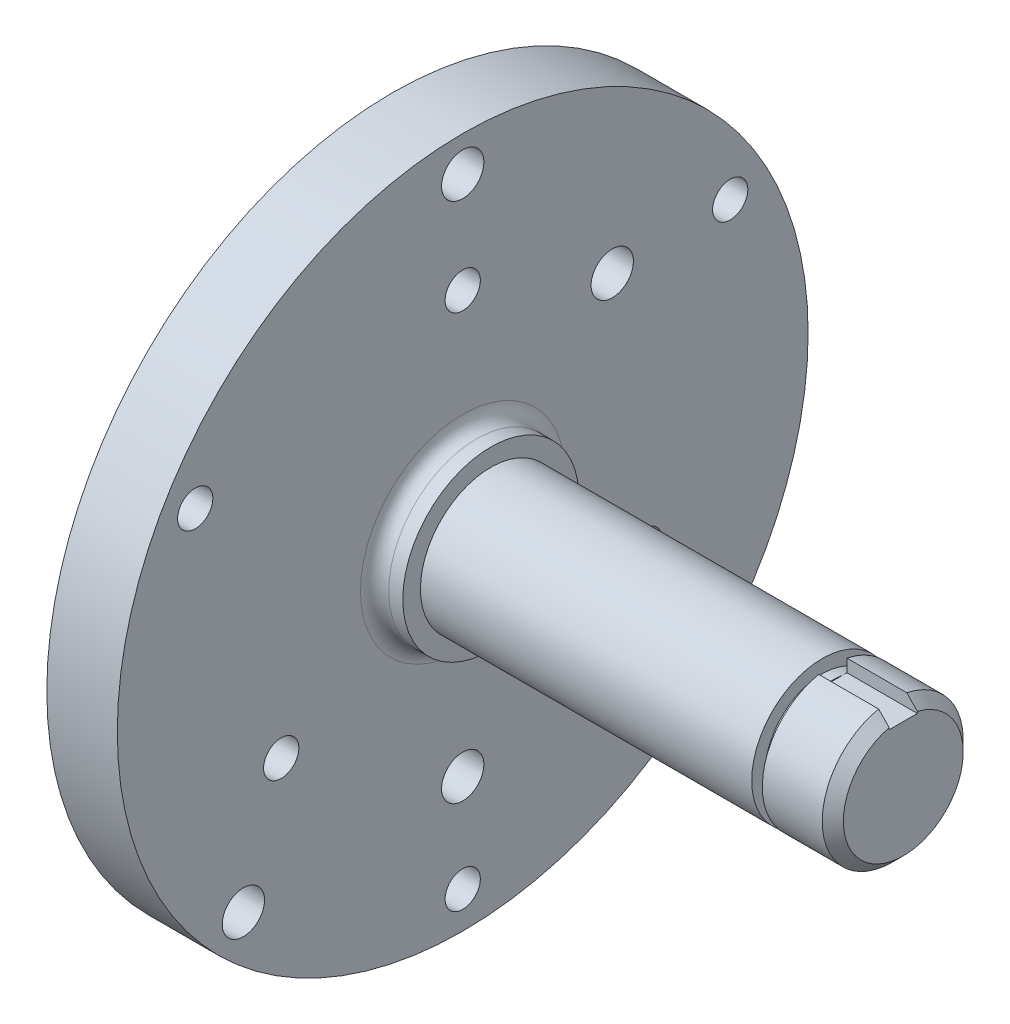
ISO-10303-21;
HEADER;
FILE_DESCRIPTION(('STEP AP214'),'2;1');
FILE_NAME('part.step','',(''),(''),'','','');
FILE_SCHEMA(('AUTOMOTIVE_DESIGN { 1 0 10303 214 1 1 1 1 }'));
ENDSEC;
DATA;
#1=APPLICATION_CONTEXT('core data for automotive mechanical design processes');
#2=APPLICATION_PROTOCOL_DEFINITION('international standard','automotive_design',2000,#1);
#3=PRODUCT_CONTEXT('',#1,'mechanical');
#4=PRODUCT('Part','Part','',(#3));
#5=PRODUCT_RELATED_PRODUCT_CATEGORY('part','',(#4));
#6=PRODUCT_DEFINITION_FORMATION('','',#4);
#7=PRODUCT_DEFINITION_CONTEXT('part definition',#1,'design');
#8=PRODUCT_DEFINITION('design','',#6,#7);
#9=PRODUCT_DEFINITION_SHAPE('','',#8);
#10=(LENGTH_UNIT() NAMED_UNIT(*) SI_UNIT(.MILLI.,.METRE.));
#11=(NAMED_UNIT(*) PLANE_ANGLE_UNIT() SI_UNIT($,.RADIAN.));
#12=(NAMED_UNIT(*) SI_UNIT($,.STERADIAN.) SOLID_ANGLE_UNIT());
#13=UNCERTAINTY_MEASURE_WITH_UNIT(LENGTH_MEASURE(1.E-05),#10,'distance_accuracy_value','');
#14=(GEOMETRIC_REPRESENTATION_CONTEXT(3) GLOBAL_UNCERTAINTY_ASSIGNED_CONTEXT((#13)) GLOBAL_UNIT_ASSIGNED_CONTEXT((#10,
#11,#12)) REPRESENTATION_CONTEXT('',''));
#15=CARTESIAN_POINT('',(0.,0.,0.));
#16=DIRECTION('',(0.,0.,1.));
#17=DIRECTION('',(1.,0.,0.));
#18=AXIS2_PLACEMENT_3D('',#15,#16,#17);
#19=CARTESIAN_POINT('',(58.5,8.50000000000002,0.));
#20=DIRECTION('',(-1.,0.,0.));
#21=DIRECTION('',(0.,0.,1.));
#22=AXIS2_PLACEMENT_3D('',#19,#20,#21);
#23=PLANE('',#22);
#24=CARTESIAN_POINT('',(58.5,0.,0.));
#25=DIRECTION('',(-1.,0.,0.));
#26=DIRECTION('',(0.,0.,1.));
#27=AXIS2_PLACEMENT_3D('',#24,#25,#26);
#28=CIRCLE('',#27,8.50000000000002);
#29=CARTESIAN_POINT('',(58.5,8.26135582092918,-2.));
#30=VERTEX_POINT('',#29);
#31=CARTESIAN_POINT('',(58.5,8.26135582092918,2.));
#32=VERTEX_POINT('',#31);
#33=EDGE_CURVE('E11',#30,#32,#28,.T.);
#34=ORIENTED_EDGE('',*,*,#33,.F.);
#35=DIRECTION('',(0.,1.,0.));
#36=VECTOR('',#35,1.);
#37=CARTESIAN_POINT('',(58.5,12.231945228133,-2.));
#38=LINE('',#37,#36);
#39=CARTESIAN_POINT('',(58.5,8.,-2.));
#40=VERTEX_POINT('',#39);
#41=EDGE_CURVE('E101',#40,#30,#38,.T.);
#42=ORIENTED_EDGE('',*,*,#41,.F.);
#43=DIRECTION('',(0.,0.,-1.));
#44=VECTOR('',#43,1.);
#45=CARTESIAN_POINT('',(58.5,8.,2.));
#46=LINE('',#45,#44);
#47=CARTESIAN_POINT('',(58.5,8.,2.));
#48=VERTEX_POINT('',#47);
#49=EDGE_CURVE('E100',#48,#40,#46,.T.);
#50=ORIENTED_EDGE('',*,*,#49,.F.);
#51=DIRECTION('',(0.,-1.,0.));
#52=VECTOR('',#51,1.);
#53=CARTESIAN_POINT('',(58.5,12.231945228133,2.));
#54=LINE('',#53,#52);
#55=EDGE_CURVE('E90',#32,#48,#54,.T.);
#56=ORIENTED_EDGE('',*,*,#55,.F.);
#57=EDGE_LOOP('',(#34,#42,#50,#56));
#58=FACE_BOUND('',#57,.T.);
#59=ADVANCED_FACE('F36',(#58),#23,.F.);
#60=CARTESIAN_POINT('',(58.5,0.,0.));
#61=DIRECTION('',(-1.,0.,0.));
#62=DIRECTION('',(0.,0.,1.));
#63=AXIS2_PLACEMENT_3D('',#60,#61,#62);
#64=CONICAL_SURFACE('',#63,8.50000000000002,0.785398163397446);
#65=CARTESIAN_POINT('',(57.,0.,0.));
#66=DIRECTION('',(-1.,0.,0.));
#67=DIRECTION('',(0.,0.,1.));
#68=AXIS2_PLACEMENT_3D('',#65,#66,#67);
#69=CIRCLE('',#68,10.);
#70=CARTESIAN_POINT('',(57.,9.79795897113272,-2.));
#71=VERTEX_POINT('',#70);
#72=CARTESIAN_POINT('',(57.,9.79795897113272,2.));
#73=VERTEX_POINT('',#72);
#74=EDGE_CURVE('E43',#71,#73,#69,.T.);
#75=ORIENTED_EDGE('',*,*,#74,.F.);
#76=CARTESIAN_POINT('',(54.9971938274741,11.8350055350737,-2.));
#77=CARTESIAN_POINT('',(55.2751644268277,11.553085229373,-2.));
#78=CARTESIAN_POINT('',(55.5530034546144,11.2710349802146,-2.));
#79=CARTESIAN_POINT('',(56.1083316345354,10.7065888676868,-2.));
#80=CARTESIAN_POINT('',(56.3858207857697,10.424193003432,-2.));
#81=CARTESIAN_POINT('',(56.9403495907767,9.85898306197648,-2.));
#82=CARTESIAN_POINT('',(57.2173892626557,9.57616900254544,-2.));
#83=CARTESIAN_POINT('',(57.7709001367474,9.00998552067228,-2.));
#84=CARTESIAN_POINT('',(58.0473713395309,8.72661609878831,-2.));
#85=CARTESIAN_POINT('',(58.5995749264486,8.15913155704971,-2.));
#86=CARTESIAN_POINT('',(58.8753072747344,7.87501640229085,-2.));
#87=CARTESIAN_POINT('',(59.425743108583,7.3057944808535,-2.));
#88=CARTESIAN_POINT('',(59.7004466012688,7.0206877210664,-2.));
#89=CARTESIAN_POINT('',(60.2484177709535,6.44907146140714,-2.));
#90=CARTESIAN_POINT('',(60.5216853851814,6.16256190125046,-2.));
#91=CARTESIAN_POINT('',(60.929972582894,5.73126239714841,-2.));
#92=CARTESIAN_POINT('',(61.0658008413644,5.58723835884961,-2.));
#93=CARTESIAN_POINT('',(61.3367727838724,5.29854588107358,-2.));
#94=CARTESIAN_POINT('',(61.4719164627037,5.15387743671125,-2.));
#95=CARTESIAN_POINT('',(61.6066441063625,5.00882099854197,-2.));
#96=B_SPLINE_CURVE_WITH_KNOTS('',3,(#76,#77,#78,#79,#80,#81,#82,#83,#84,#85,#86,#87,#88,#89,#90,
#91,#92,#93,#94,#95),.UNSPECIFIED.,.F.,.F.,(4,2,2,2,2,2,2,2,2,4),(0.,1.1877377056553,
2.37547846038731,3.56317011874796,4.75086058408524,5.93860766787936,7.12634651357384,
8.31413685766753,8.90804578151927,9.50195921534978),.UNSPECIFIED.);
#97=EDGE_CURVE('E58',#71,#30,#96,.T.);
#98=ORIENTED_EDGE('',*,*,#97,.T.);
#99=ORIENTED_EDGE('',*,*,#33,.T.);
#100=CARTESIAN_POINT('',(61.6066441063625,5.00882099854197,2.));
#101=CARTESIAN_POINT('',(61.4719164627037,5.15387743671125,2.));
#102=CARTESIAN_POINT('',(61.3367727838724,5.29854588107358,2.));
#103=CARTESIAN_POINT('',(61.0658008413644,5.58723835884961,2.));
#104=CARTESIAN_POINT('',(60.929972582894,5.7312623971484,2.));
#105=CARTESIAN_POINT('',(60.5216853851814,6.16256190125046,2.));
#106=CARTESIAN_POINT('',(60.2484177709535,6.44907146140714,2.));
#107=CARTESIAN_POINT('',(59.7004466012688,7.0206877210664,2.));
#108=CARTESIAN_POINT('',(59.425743108583,7.30579448085349,2.));
#109=CARTESIAN_POINT('',(58.8753072747344,7.87501640229085,2.));
#110=CARTESIAN_POINT('',(58.5995749264487,8.15913155704972,2.));
#111=CARTESIAN_POINT('',(58.0473713395309,8.72661609878832,2.));
#112=CARTESIAN_POINT('',(57.7709001367474,9.00998552067229,2.));
#113=CARTESIAN_POINT('',(57.2173892626557,9.57616900254544,2.));
#114=CARTESIAN_POINT('',(56.9403495907767,9.85898306197648,2.));
#115=CARTESIAN_POINT('',(56.3858207857697,10.424193003432,2.));
#116=CARTESIAN_POINT('',(56.1083316345354,10.7065888676868,2.));
#117=CARTESIAN_POINT('',(55.5530034546144,11.2710349802146,2.));
#118=CARTESIAN_POINT('',(55.2751644268277,11.553085229373,2.));
#119=CARTESIAN_POINT('',(54.9971938274741,11.8350055350737,2.));
#120=B_SPLINE_CURVE_WITH_KNOTS('',3,(#100,#101,#102,#103,#104,#105,#106,#107,#108,#109,#110,
#111,#112,#113,#114,#115,#116,#117,#118,#119),.UNSPECIFIED.,.F.,.F.,(4,2,2,2,2,2,2,2,2,4),(0.,
0.593913433830508,1.18782235768225,2.37561270177594,3.56335154747042,4.75109863126454,
5.93878909660181,7.12648075496247,8.31422150969448,9.50195921534978),.UNSPECIFIED.);
#121=EDGE_CURVE('E96',#32,#73,#120,.T.);
#122=ORIENTED_EDGE('',*,*,#121,.T.);
#123=EDGE_LOOP('',(#75,#98,#99,#122));
#124=FACE_BOUND('',#123,.T.);
#125=ADVANCED_FACE('F126',(#124),#64,.T.);
#126=CARTESIAN_POINT('',(-18.2864310752294,0.,0.));
#127=DIRECTION('',(-1.,0.,0.));
#128=DIRECTION('',(0.,0.,1.));
#129=AXIS2_PLACEMENT_3D('',#126,#127,#128);
#130=CYLINDRICAL_SURFACE('',#129,10.);
#131=CARTESIAN_POINT('',(48.5,0.,0.));
#132=DIRECTION('',(-1.,0.,0.));
#133=DIRECTION('',(0.,0.,1.));
#134=AXIS2_PLACEMENT_3D('',#131,#132,#133);
#135=CIRCLE('',#134,10.);
#136=CARTESIAN_POINT('',(48.5,9.79795897113272,-2.));
#137=VERTEX_POINT('',#136);
#138=CARTESIAN_POINT('',(48.5,9.79795897113272,2.));
#139=VERTEX_POINT('',#138);
#140=EDGE_CURVE('E233',#137,#139,#135,.T.);
#141=ORIENTED_EDGE('',*,*,#140,.F.);
#142=DIRECTION('',(-1.,0.,0.));
#143=VECTOR('',#142,1.);
#144=CARTESIAN_POINT('',(-18.2864310752294,9.79795897113272,-2.));
#145=LINE('',#144,#143);
#146=EDGE_CURVE('E124',#137,#71,#145,.F.);
#147=ORIENTED_EDGE('',*,*,#146,.T.);
#148=ORIENTED_EDGE('',*,*,#74,.T.);
#149=DIRECTION('',(-1.,0.,0.));
#150=VECTOR('',#149,1.);
#151=CARTESIAN_POINT('',(-18.2864310752294,9.79795897113272,2.));
#152=LINE('',#151,#150);
#153=EDGE_CURVE('E115',#73,#139,#152,.T.);
#154=ORIENTED_EDGE('',*,*,#153,.T.);
#155=EDGE_LOOP('',(#141,#147,#148,#154));
#156=FACE_BOUND('',#155,.T.);
#157=ADVANCED_FACE('F239',(#156),#130,.T.);
#158=CARTESIAN_POINT('',(48.5,8.12772302046932,0.));
#159=DIRECTION('',(1.,0.,0.));
#160=DIRECTION('',(0.,0.,-1.));
#161=AXIS2_PLACEMENT_3D('',#158,#159,#160);
#162=PLANE('',#161);
#163=DIRECTION('',(0.,0.,1.));
#164=VECTOR('',#163,1.);
#165=CARTESIAN_POINT('',(48.5,8.,2.));
#166=LINE('',#165,#164);
#167=CARTESIAN_POINT('',(48.5,8.,-2.));
#168=VERTEX_POINT('',#167);
#169=CARTESIAN_POINT('',(48.5,8.,-1.43522872653351));
#170=VERTEX_POINT('',#169);
#171=EDGE_CURVE('E50',#168,#170,#166,.T.);
#172=ORIENTED_EDGE('',*,*,#171,.F.);
#173=DIRECTION('',(0.,-1.,0.));
#174=VECTOR('',#173,1.);
#175=CARTESIAN_POINT('',(48.5,12.231945228133,-2.));
#176=LINE('',#175,#174);
#177=EDGE_CURVE('E118',#137,#168,#176,.T.);
#178=ORIENTED_EDGE('',*,*,#177,.F.);
#179=ORIENTED_EDGE('',*,*,#140,.T.);
#180=DIRECTION('',(0.,1.,0.));
#181=VECTOR('',#180,1.);
#182=CARTESIAN_POINT('',(48.5,12.231945228133,2.));
#183=LINE('',#182,#181);
#184=CARTESIAN_POINT('',(48.5,8.,2.));
#185=VERTEX_POINT('',#184);
#186=EDGE_CURVE('E113',#185,#139,#183,.T.);
#187=ORIENTED_EDGE('',*,*,#186,.F.);
#188=CARTESIAN_POINT('',(48.5,8.,1.43522872653351));
#189=VERTEX_POINT('',#188);
#190=EDGE_CURVE('E107',#189,#185,#166,.T.);
#191=ORIENTED_EDGE('',*,*,#190,.F.);
#192=CARTESIAN_POINT('',(48.5,0.,0.));
#193=DIRECTION('',(-1.,0.,0.));
#194=DIRECTION('',(0.,0.,1.));
#195=AXIS2_PLACEMENT_3D('',#192,#193,#194);
#196=CIRCLE('',#195,8.12772302046932);
#197=EDGE_CURVE('E229',#170,#189,#196,.T.);
#198=ORIENTED_EDGE('',*,*,#197,.F.);
#199=EDGE_LOOP('',(#172,#178,#179,#187,#191,#198));
#200=FACE_BOUND('',#199,.T.);
#201=ADVANCED_FACE('F246',(#200),#162,.F.);
#202=CARTESIAN_POINT('',(-18.2864310752294,0.,0.));
#203=DIRECTION('',(-1.,0.,0.));
#204=DIRECTION('',(0.,0.,1.));
#205=AXIS2_PLACEMENT_3D('',#202,#203,#204);
#206=CYLINDRICAL_SURFACE('',#205,8.12772302046932);
#207=CARTESIAN_POINT('',(47.,0.,0.));
#208=DIRECTION('',(-1.,0.,0.));
#209=DIRECTION('',(0.,0.,1.));
#210=AXIS2_PLACEMENT_3D('',#207,#208,#209);
#211=CIRCLE('',#210,8.12772302046932);
#212=CARTESIAN_POINT('',(47.,0.,8.12772302046932));
#213=VERTEX_POINT('',#212);
#214=EDGE_CURVE('E226',#213,#213,#211,.T.);
#215=ORIENTED_EDGE('',*,*,#214,.F.);
#216=EDGE_LOOP('',(#215));
#217=FACE_BOUND('',#216,.T.);
#218=EDGE_CURVE('E230',#189,#170,#196,.T.);
#219=ORIENTED_EDGE('',*,*,#218,.T.);
#220=ORIENTED_EDGE('',*,*,#197,.T.);
#221=EDGE_LOOP('',(#219,#220));
#222=FACE_BOUND('',#221,.T.);
#223=ADVANCED_FACE('F273',(#217,#222),#206,.T.);
#224=CARTESIAN_POINT('',(47.,10.,0.));
#225=DIRECTION('',(-1.,0.,0.));
#226=DIRECTION('',(0.,0.,1.));
#227=AXIS2_PLACEMENT_3D('',#224,#225,#226);
#228=PLANE('',#227);
#229=CARTESIAN_POINT('',(47.,0.,0.));
#230=DIRECTION('',(-1.,0.,0.));
#231=DIRECTION('',(0.,0.,1.));
#232=AXIS2_PLACEMENT_3D('',#229,#230,#231);
#233=CIRCLE('',#232,10.);
#234=CARTESIAN_POINT('',(47.,0.,10.));
#235=VERTEX_POINT('',#234);
#236=EDGE_CURVE('E223',#235,#235,#233,.T.);
#237=ORIENTED_EDGE('',*,*,#236,.F.);
#238=EDGE_LOOP('',(#237));
#239=FACE_BOUND('',#238,.T.);
#240=ORIENTED_EDGE('',*,*,#214,.T.);
#241=EDGE_LOOP('',(#240));
#242=FACE_BOUND('',#241,.T.);
#243=ADVANCED_FACE('F283',(#239,#242),#228,.F.);
#244=CARTESIAN_POINT('',(-18.2864310752294,0.,0.));
#245=DIRECTION('',(-1.,0.,0.));
#246=DIRECTION('',(0.,0.,1.));
#247=AXIS2_PLACEMENT_3D('',#244,#245,#246);
#248=CYLINDRICAL_SURFACE('',#247,10.);
#249=CARTESIAN_POINT('',(0.,0.,0.));
#250=DIRECTION('',(-1.,0.,0.));
#251=DIRECTION('',(0.,0.,1.));
#252=AXIS2_PLACEMENT_3D('',#249,#250,#251);
#253=CIRCLE('',#252,10.);
#254=CARTESIAN_POINT('',(0.,0.,10.));
#255=VERTEX_POINT('',#254);
#256=EDGE_CURVE('E220',#255,#255,#253,.T.);
#257=ORIENTED_EDGE('',*,*,#256,.F.);
#258=EDGE_LOOP('',(#257));
#259=FACE_BOUND('',#258,.T.);
#260=ORIENTED_EDGE('',*,*,#236,.T.);
#261=EDGE_LOOP('',(#260));
#262=FACE_BOUND('',#261,.T.);
#263=ADVANCED_FACE('F444',(#259,#262),#248,.T.);
#264=CARTESIAN_POINT('',(0.,12.5,0.));
#265=DIRECTION('',(-1.,0.,0.));
#266=DIRECTION('',(0.,0.,1.));
#267=AXIS2_PLACEMENT_3D('',#264,#265,#266);
#268=PLANE('',#267);
#269=CARTESIAN_POINT('',(0.,0.,0.));
#270=DIRECTION('',(-1.,0.,0.));
#271=DIRECTION('',(0.,0.,1.));
#272=AXIS2_PLACEMENT_3D('',#269,#270,#271);
#273=CIRCLE('',#272,12.5);
#274=CARTESIAN_POINT('',(0.,0.,12.5));
#275=VERTEX_POINT('',#274);
#276=EDGE_CURVE('E217',#275,#275,#273,.T.);
#277=ORIENTED_EDGE('',*,*,#276,.F.);
#278=EDGE_LOOP('',(#277));
#279=FACE_BOUND('',#278,.T.);
#280=ORIENTED_EDGE('',*,*,#256,.T.);
#281=EDGE_LOOP('',(#280));
#282=FACE_BOUND('',#281,.T.);
#283=ADVANCED_FACE('F436',(#279,#282),#268,.F.);
#284=CARTESIAN_POINT('',(-18.2864310752294,0.,0.));
#285=DIRECTION('',(-1.,0.,0.));
#286=DIRECTION('',(0.,0.,1.));
#287=AXIS2_PLACEMENT_3D('',#284,#285,#286);
#288=CYLINDRICAL_SURFACE('',#287,12.5);
#289=CARTESIAN_POINT('',(-1.99999999999998,0.,0.));
#290=DIRECTION('',(-1.,0.,0.));
#291=DIRECTION('',(0.,0.,1.));
#292=AXIS2_PLACEMENT_3D('',#289,#290,#291);
#293=CIRCLE('',#292,12.5);
#294=CARTESIAN_POINT('',(-1.99999999999998,0.,12.5));
#295=VERTEX_POINT('',#294);
#296=EDGE_CURVE('E214',#295,#295,#293,.T.);
#297=ORIENTED_EDGE('',*,*,#296,.F.);
#298=EDGE_LOOP('',(#297));
#299=FACE_BOUND('',#298,.T.);
#300=ORIENTED_EDGE('',*,*,#276,.T.);
#301=EDGE_LOOP('',(#300));
#302=FACE_BOUND('',#301,.T.);
#303=ADVANCED_FACE('F428',(#299,#302),#288,.T.);
#304=CARTESIAN_POINT('',(-1.99999999999999,0.,0.));
#305=DIRECTION('',(-1.,0.,0.));
#306=DIRECTION('',(0.,0.,1.));
#307=AXIS2_PLACEMENT_3D('',#304,#305,#306);
#308=TOROIDAL_SURFACE('',#307,14.5,2.);
#309=CARTESIAN_POINT('',(-3.99999999999999,0.,0.));
#310=DIRECTION('',(-1.,0.,0.));
#311=DIRECTION('',(0.,0.,1.));
#312=AXIS2_PLACEMENT_3D('',#309,#310,#311);
#313=CIRCLE('',#312,14.5);
#314=CARTESIAN_POINT('',(-3.99999999999999,0.,14.5));
#315=VERTEX_POINT('',#314);
#316=EDGE_CURVE('E211',#315,#315,#313,.T.);
#317=ORIENTED_EDGE('',*,*,#316,.F.);
#318=EDGE_LOOP('',(#317));
#319=FACE_BOUND('',#318,.T.);
#320=ORIENTED_EDGE('',*,*,#296,.T.);
#321=EDGE_LOOP('',(#320));
#322=FACE_BOUND('',#321,.T.);
#323=ADVANCED_FACE('F421',(#319,#322),#308,.F.);
#324=CARTESIAN_POINT('',(-4.,49.,0.));
#325=DIRECTION('',(-1.,0.,0.));
#326=DIRECTION('',(0.,0.,1.));
#327=AXIS2_PLACEMENT_3D('',#324,#325,#326);
#328=PLANE('',#327);
#329=CARTESIAN_POINT('',(-4.,-14.8660687473183,-25.7487863791676));
#330=DIRECTION('',(1.,0.,0.));
#331=DIRECTION('',(0.,0.,-1.));
#332=AXIS2_PLACEMENT_3D('',#329,#330,#331);
#333=CIRCLE('',#332,2.49999999999999);
#334=CARTESIAN_POINT('',(-4.,-14.8660687473183,-28.2487863791676));
#335=VERTEX_POINT('',#334);
#336=EDGE_CURVE('E148',#335,#335,#333,.T.);
#337=ORIENTED_EDGE('',*,*,#336,.F.);
#338=EDGE_LOOP('',(#337));
#339=FACE_BOUND('',#338,.T.);
#340=CARTESIAN_POINT('',(-4.,21.9089023002063,37.9473319220208));
#341=DIRECTION('',(1.,0.,0.));
#342=DIRECTION('',(0.,0.,-1.));
#343=AXIS2_PLACEMENT_3D('',#340,#341,#342);
#344=CIRCLE('',#343,2.49999999999999);
#345=CARTESIAN_POINT('',(-4.,21.9089023002063,35.4473319220208));
#346=VERTEX_POINT('',#345);
#347=EDGE_CURVE('E154',#346,#346,#344,.T.);
#348=ORIENTED_EDGE('',*,*,#347,.F.);
#349=EDGE_LOOP('',(#348));
#350=FACE_BOUND('',#349,.T.);
#351=CARTESIAN_POINT('',(-4.,-14.8660687473186,25.7487863791674));
#352=DIRECTION('',(1.,0.,0.));
#353=DIRECTION('',(0.,0.,-1.));
#354=AXIS2_PLACEMENT_3D('',#351,#352,#353);
#355=CIRCLE('',#354,2.49999999999999);
#356=CARTESIAN_POINT('',(-4.,-14.8660687473186,23.2487863791674));
#357=VERTEX_POINT('',#356);
#358=EDGE_CURVE('E160',#357,#357,#355,.T.);
#359=ORIENTED_EDGE('',*,*,#358,.F.);
#360=EDGE_LOOP('',(#359));
#361=FACE_BOUND('',#360,.T.);
#362=CARTESIAN_POINT('',(-4.,21.9089023002068,-37.9473319220205));
#363=DIRECTION('',(1.,0.,0.));
#364=DIRECTION('',(0.,0.,-1.));
#365=AXIS2_PLACEMENT_3D('',#362,#363,#364);
#366=CIRCLE('',#365,2.49999999999999);
#367=CARTESIAN_POINT('',(-4.,21.9089023002068,-40.4473319220204));
#368=VERTEX_POINT('',#367);
#369=EDGE_CURVE('E166',#368,#368,#366,.T.);
#370=ORIENTED_EDGE('',*,*,#369,.F.);
#371=EDGE_LOOP('',(#370));
#372=FACE_BOUND('',#371,.T.);
#373=CARTESIAN_POINT('',(-4.,29.732137494637,0.));
#374=DIRECTION('',(1.,0.,0.));
#375=DIRECTION('',(0.,0.,-1.));
#376=AXIS2_PLACEMENT_3D('',#373,#374,#375);
#377=CIRCLE('',#376,2.49999999999999);
#378=CARTESIAN_POINT('',(-4.,29.732137494637,-2.49999999999999));
#379=VERTEX_POINT('',#378);
#380=EDGE_CURVE('E172',#379,#379,#377,.T.);
#381=ORIENTED_EDGE('',*,*,#380,.F.);
#382=EDGE_LOOP('',(#381));
#383=FACE_BOUND('',#382,.T.);
#384=CARTESIAN_POINT('',(-4.,-43.8178046004133,0.));
#385=DIRECTION('',(1.,0.,0.));
#386=DIRECTION('',(0.,0.,-1.));
#387=AXIS2_PLACEMENT_3D('',#384,#385,#386);
#388=CIRCLE('',#387,2.49999999999999);
#389=CARTESIAN_POINT('',(-4.,-43.8178046004133,-2.49999999999999));
#390=VERTEX_POINT('',#389);
#391=EDGE_CURVE('E178',#390,#390,#388,.T.);
#392=ORIENTED_EDGE('',*,*,#391,.F.);
#393=EDGE_LOOP('',(#392));
#394=FACE_BOUND('',#393,.T.);
#395=CARTESIAN_POINT('',(-3.99999999999999,-31.1126983722081,31.112698372208));
#396=DIRECTION('',(-1.,0.,0.));
#397=DIRECTION('',(0.,0.,1.));
#398=AXIS2_PLACEMENT_3D('',#395,#396,#397);
#399=CIRCLE('',#398,3.);
#400=CARTESIAN_POINT('',(-3.99999999999999,-31.1126983722081,34.112698372208));
#401=VERTEX_POINT('',#400);
#402=EDGE_CURVE('E184',#401,#401,#399,.F.);
#403=ORIENTED_EDGE('',*,*,#402,.F.);
#404=EDGE_LOOP('',(#403));
#405=FACE_BOUND('',#404,.T.);
#406=CARTESIAN_POINT('',(-3.99999999999999,44.,0.));
#407=DIRECTION('',(-1.,0.,0.));
#408=DIRECTION('',(0.,0.,1.));
#409=AXIS2_PLACEMENT_3D('',#406,#407,#408);
#410=CIRCLE('',#409,3.);
#411=CARTESIAN_POINT('',(-3.99999999999999,44.,3.));
#412=VERTEX_POINT('',#411);
#413=EDGE_CURVE('E190',#412,#412,#410,.F.);
#414=ORIENTED_EDGE('',*,*,#413,.F.);
#415=EDGE_LOOP('',(#414));
#416=FACE_BOUND('',#415,.T.);
#417=CARTESIAN_POINT('',(-3.99999999999999,21.2132034355963,-21.2132034355965));
#418=DIRECTION('',(-1.,0.,0.));
#419=DIRECTION('',(0.,0.,1.));
#420=AXIS2_PLACEMENT_3D('',#417,#418,#419);
#421=CIRCLE('',#420,2.99999999999999);
#422=CARTESIAN_POINT('',(-3.99999999999999,21.2132034355963,-18.2132034355965));
#423=VERTEX_POINT('',#422);
#424=EDGE_CURVE('E196',#423,#423,#421,.F.);
#425=ORIENTED_EDGE('',*,*,#424,.F.);
#426=EDGE_LOOP('',(#425));
#427=FACE_BOUND('',#426,.T.);
#428=CARTESIAN_POINT('',(-3.99999999999999,-30.,0.));
#429=DIRECTION('',(-1.,0.,0.));
#430=DIRECTION('',(0.,0.,1.));
#431=AXIS2_PLACEMENT_3D('',#428,#429,#430);
#432=CIRCLE('',#431,3.);
#433=CARTESIAN_POINT('',(-3.99999999999999,-30.,3.00000000000001));
#434=VERTEX_POINT('',#433);
#435=EDGE_CURVE('E202',#434,#434,#432,.F.);
#436=ORIENTED_EDGE('',*,*,#435,.F.);
#437=EDGE_LOOP('',(#436));
#438=FACE_BOUND('',#437,.T.);
#439=CARTESIAN_POINT('',(-4.,0.,0.));
#440=DIRECTION('',(-1.,0.,0.));
#441=DIRECTION('',(0.,0.,1.));
#442=AXIS2_PLACEMENT_3D('',#439,#440,#441);
#443=CIRCLE('',#442,49.);
#444=CARTESIAN_POINT('',(-4.,0.,49.));
#445=VERTEX_POINT('',#444);
#446=EDGE_CURVE('E208',#445,#445,#443,.T.);
#447=ORIENTED_EDGE('',*,*,#446,.F.);
#448=EDGE_LOOP('',(#447));
#449=FACE_BOUND('',#448,.T.);
#450=ORIENTED_EDGE('',*,*,#316,.T.);
#451=EDGE_LOOP('',(#450));
#452=FACE_BOUND('',#451,.T.);
#453=ADVANCED_FACE('F413',(#339,#350,#361,#372,#383,#394,#405,#416,#427,#438,#449,#452),#328,.F.);
#454=CARTESIAN_POINT('',(-18.2864310752294,0.,0.));
#455=DIRECTION('',(-1.,0.,0.));
#456=DIRECTION('',(0.,0.,1.));
#457=AXIS2_PLACEMENT_3D('',#454,#455,#456);
#458=CYLINDRICAL_SURFACE('',#457,49.);
#459=CARTESIAN_POINT('',(-14.,0.,0.));
#460=DIRECTION('',(-1.,0.,0.));
#461=DIRECTION('',(0.,0.,1.));
#462=AXIS2_PLACEMENT_3D('',#459,#460,#461);
#463=CIRCLE('',#462,49.);
#464=CARTESIAN_POINT('',(-14.,0.,49.));
#465=VERTEX_POINT('',#464);
#466=EDGE_CURVE('E205',#465,#465,#463,.T.);
#467=ORIENTED_EDGE('',*,*,#466,.F.);
#468=EDGE_LOOP('',(#467));
#469=FACE_BOUND('',#468,.T.);
#470=ORIENTED_EDGE('',*,*,#446,.T.);
#471=EDGE_LOOP('',(#470));
#472=FACE_BOUND('',#471,.T.);
#473=ADVANCED_FACE('F405',(#469,#472),#458,.T.);
#474=CARTESIAN_POINT('',(-14.,0.,0.));
#475=DIRECTION('',(1.,0.,0.));
#476=DIRECTION('',(0.,0.,-1.));
#477=AXIS2_PLACEMENT_3D('',#474,#475,#476);
#478=PLANE('',#477);
#479=CARTESIAN_POINT('',(-14.,-14.8660687473183,-25.7487863791676));
#480=DIRECTION('',(1.,0.,0.));
#481=DIRECTION('',(0.,0.,-1.));
#482=AXIS2_PLACEMENT_3D('',#479,#480,#481);
#483=CIRCLE('',#482,2.49999999999999);
#484=CARTESIAN_POINT('',(-14.,-14.8660687473183,-28.2487863791676));
#485=VERTEX_POINT('',#484);
#486=EDGE_CURVE('E145',#485,#485,#483,.T.);
#487=ORIENTED_EDGE('',*,*,#486,.T.);
#488=EDGE_LOOP('',(#487));
#489=FACE_BOUND('',#488,.T.);
#490=CARTESIAN_POINT('',(-14.,21.9089023002063,37.9473319220208));
#491=DIRECTION('',(1.,0.,0.));
#492=DIRECTION('',(0.,0.,-1.));
#493=AXIS2_PLACEMENT_3D('',#490,#491,#492);
#494=CIRCLE('',#493,2.49999999999999);
#495=CARTESIAN_POINT('',(-14.,21.9089023002063,35.4473319220208));
#496=VERTEX_POINT('',#495);
#497=EDGE_CURVE('E151',#496,#496,#494,.T.);
#498=ORIENTED_EDGE('',*,*,#497,.T.);
#499=EDGE_LOOP('',(#498));
#500=FACE_BOUND('',#499,.T.);
#501=CARTESIAN_POINT('',(-14.,-14.8660687473186,25.7487863791674));
#502=DIRECTION('',(1.,0.,0.));
#503=DIRECTION('',(0.,0.,-1.));
#504=AXIS2_PLACEMENT_3D('',#501,#502,#503);
#505=CIRCLE('',#504,2.49999999999999);
#506=CARTESIAN_POINT('',(-14.,-14.8660687473186,23.2487863791674));
#507=VERTEX_POINT('',#506);
#508=EDGE_CURVE('E157',#507,#507,#505,.T.);
#509=ORIENTED_EDGE('',*,*,#508,.T.);
#510=EDGE_LOOP('',(#509));
#511=FACE_BOUND('',#510,.T.);
#512=CARTESIAN_POINT('',(-14.,21.9089023002068,-37.9473319220205));
#513=DIRECTION('',(1.,0.,0.));
#514=DIRECTION('',(0.,0.,-1.));
#515=AXIS2_PLACEMENT_3D('',#512,#513,#514);
#516=CIRCLE('',#515,2.49999999999999);
#517=CARTESIAN_POINT('',(-14.,21.9089023002068,-40.4473319220204));
#518=VERTEX_POINT('',#517);
#519=EDGE_CURVE('E163',#518,#518,#516,.T.);
#520=ORIENTED_EDGE('',*,*,#519,.T.);
#521=EDGE_LOOP('',(#520));
#522=FACE_BOUND('',#521,.T.);
#523=CARTESIAN_POINT('',(-14.,29.732137494637,0.));
#524=DIRECTION('',(1.,0.,0.));
#525=DIRECTION('',(0.,0.,-1.));
#526=AXIS2_PLACEMENT_3D('',#523,#524,#525);
#527=CIRCLE('',#526,2.49999999999999);
#528=CARTESIAN_POINT('',(-14.,29.732137494637,-2.49999999999999));
#529=VERTEX_POINT('',#528);
#530=EDGE_CURVE('E169',#529,#529,#527,.T.);
#531=ORIENTED_EDGE('',*,*,#530,.T.);
#532=EDGE_LOOP('',(#531));
#533=FACE_BOUND('',#532,.T.);
#534=CARTESIAN_POINT('',(-14.,-43.8178046004133,0.));
#535=DIRECTION('',(1.,0.,0.));
#536=DIRECTION('',(0.,0.,-1.));
#537=AXIS2_PLACEMENT_3D('',#534,#535,#536);
#538=CIRCLE('',#537,2.49999999999999);
#539=CARTESIAN_POINT('',(-14.,-43.8178046004133,-2.49999999999999));
#540=VERTEX_POINT('',#539);
#541=EDGE_CURVE('E175',#540,#540,#538,.T.);
#542=ORIENTED_EDGE('',*,*,#541,.T.);
#543=EDGE_LOOP('',(#542));
#544=FACE_BOUND('',#543,.T.);
#545=CARTESIAN_POINT('',(-14.,-31.1126983722081,31.112698372208));
#546=DIRECTION('',(-1.,0.,0.));
#547=DIRECTION('',(0.,0.,1.));
#548=AXIS2_PLACEMENT_3D('',#545,#546,#547);
#549=CIRCLE('',#548,3.);
#550=CARTESIAN_POINT('',(-14.,-31.1126983722081,34.112698372208));
#551=VERTEX_POINT('',#550);
#552=EDGE_CURVE('E181',#551,#551,#549,.T.);
#553=ORIENTED_EDGE('',*,*,#552,.F.);
#554=EDGE_LOOP('',(#553));
#555=FACE_BOUND('',#554,.T.);
#556=CARTESIAN_POINT('',(-14.,44.,0.));
#557=DIRECTION('',(-1.,0.,0.));
#558=DIRECTION('',(0.,0.,1.));
#559=AXIS2_PLACEMENT_3D('',#556,#557,#558);
#560=CIRCLE('',#559,3.);
#561=CARTESIAN_POINT('',(-14.,44.,3.));
#562=VERTEX_POINT('',#561);
#563=EDGE_CURVE('E187',#562,#562,#560,.T.);
#564=ORIENTED_EDGE('',*,*,#563,.F.);
#565=EDGE_LOOP('',(#564));
#566=FACE_BOUND('',#565,.T.);
#567=CARTESIAN_POINT('',(-14.,21.2132034355963,-21.2132034355965));
#568=DIRECTION('',(-1.,0.,0.));
#569=DIRECTION('',(0.,0.,1.));
#570=AXIS2_PLACEMENT_3D('',#567,#568,#569);
#571=CIRCLE('',#570,2.99999999999999);
#572=CARTESIAN_POINT('',(-14.,21.2132034355963,-18.2132034355965));
#573=VERTEX_POINT('',#572);
#574=EDGE_CURVE('E193',#573,#573,#571,.T.);
#575=ORIENTED_EDGE('',*,*,#574,.F.);
#576=EDGE_LOOP('',(#575));
#577=FACE_BOUND('',#576,.T.);
#578=CARTESIAN_POINT('',(-14.,-30.,0.));
#579=DIRECTION('',(-1.,0.,0.));
#580=DIRECTION('',(0.,0.,1.));
#581=AXIS2_PLACEMENT_3D('',#578,#579,#580);
#582=CIRCLE('',#581,3.);
#583=CARTESIAN_POINT('',(-14.,-30.,3.00000000000001));
#584=VERTEX_POINT('',#583);
#585=EDGE_CURVE('E199',#584,#584,#582,.T.);
#586=ORIENTED_EDGE('',*,*,#585,.F.);
#587=EDGE_LOOP('',(#586));
#588=FACE_BOUND('',#587,.T.);
#589=ORIENTED_EDGE('',*,*,#466,.T.);
#590=EDGE_LOOP('',(#589));
#591=FACE_BOUND('',#590,.T.);
#592=ADVANCED_FACE('F396',(#489,#500,#511,#522,#533,#544,#555,#566,#577,#588,#591),#478,.F.);
#593=CARTESIAN_POINT('',(58.501,-30.,0.));
#594=DIRECTION('',(-1.,0.,0.));
#595=DIRECTION('',(0.,0.,1.));
#596=AXIS2_PLACEMENT_3D('',#593,#594,#595);
#597=CYLINDRICAL_SURFACE('',#596,3.);
#598=ORIENTED_EDGE('',*,*,#585,.T.);
#599=EDGE_LOOP('',(#598));
#600=FACE_BOUND('',#599,.T.);
#601=ORIENTED_EDGE('',*,*,#435,.T.);
#602=EDGE_LOOP('',(#601));
#603=FACE_BOUND('',#602,.T.);
#604=ADVANCED_FACE('F388',(#600,#603),#597,.F.);
#605=CARTESIAN_POINT('',(58.501,21.2132034355963,-21.2132034355965));
#606=DIRECTION('',(-1.,0.,0.));
#607=DIRECTION('',(0.,0.,1.));
#608=AXIS2_PLACEMENT_3D('',#605,#606,#607);
#609=CYLINDRICAL_SURFACE('',#608,2.99999999999999);
#610=ORIENTED_EDGE('',*,*,#574,.T.);
#611=EDGE_LOOP('',(#610));
#612=FACE_BOUND('',#611,.T.);
#613=ORIENTED_EDGE('',*,*,#424,.T.);
#614=EDGE_LOOP('',(#613));
#615=FACE_BOUND('',#614,.T.);
#616=ADVANCED_FACE('F380',(#612,#615),#609,.F.);
#617=CARTESIAN_POINT('',(58.501,44.,0.));
#618=DIRECTION('',(-1.,0.,0.));
#619=DIRECTION('',(0.,0.,1.));
#620=AXIS2_PLACEMENT_3D('',#617,#618,#619);
#621=CYLINDRICAL_SURFACE('',#620,3.);
#622=ORIENTED_EDGE('',*,*,#563,.T.);
#623=EDGE_LOOP('',(#622));
#624=FACE_BOUND('',#623,.T.);
#625=ORIENTED_EDGE('',*,*,#413,.T.);
#626=EDGE_LOOP('',(#625));
#627=FACE_BOUND('',#626,.T.);
#628=ADVANCED_FACE('F372',(#624,#627),#621,.F.);
#629=CARTESIAN_POINT('',(58.501,-31.1126983722081,31.112698372208));
#630=DIRECTION('',(-1.,0.,0.));
#631=DIRECTION('',(0.,0.,1.));
#632=AXIS2_PLACEMENT_3D('',#629,#630,#631);
#633=CYLINDRICAL_SURFACE('',#632,3.);
#634=ORIENTED_EDGE('',*,*,#552,.T.);
#635=EDGE_LOOP('',(#634));
#636=FACE_BOUND('',#635,.T.);
#637=ORIENTED_EDGE('',*,*,#402,.T.);
#638=EDGE_LOOP('',(#637));
#639=FACE_BOUND('',#638,.T.);
#640=ADVANCED_FACE('F364',(#636,#639),#633,.F.);
#641=CARTESIAN_POINT('',(-4.,-43.8178046004133,0.));
#642=DIRECTION('',(1.,0.,0.));
#643=DIRECTION('',(0.,0.,-1.));
#644=AXIS2_PLACEMENT_3D('',#641,#642,#643);
#645=CYLINDRICAL_SURFACE('',#644,2.49999999999999);
#646=ORIENTED_EDGE('',*,*,#541,.F.);
#647=EDGE_LOOP('',(#646));
#648=FACE_BOUND('',#647,.T.);
#649=ORIENTED_EDGE('',*,*,#391,.T.);
#650=EDGE_LOOP('',(#649));
#651=FACE_BOUND('',#650,.T.);
#652=ADVANCED_FACE('F356',(#648,#651),#645,.F.);
#653=CARTESIAN_POINT('',(-4.,29.732137494637,0.));
#654=DIRECTION('',(1.,0.,0.));
#655=DIRECTION('',(0.,0.,-1.));
#656=AXIS2_PLACEMENT_3D('',#653,#654,#655);
#657=CYLINDRICAL_SURFACE('',#656,2.49999999999999);
#658=ORIENTED_EDGE('',*,*,#530,.F.);
#659=EDGE_LOOP('',(#658));
#660=FACE_BOUND('',#659,.T.);
#661=ORIENTED_EDGE('',*,*,#380,.T.);
#662=EDGE_LOOP('',(#661));
#663=FACE_BOUND('',#662,.T.);
#664=ADVANCED_FACE('F348',(#660,#663),#657,.F.);
#665=CARTESIAN_POINT('',(-4.,21.9089023002068,-37.9473319220205));
#666=DIRECTION('',(1.,0.,0.));
#667=DIRECTION('',(0.,0.,-1.));
#668=AXIS2_PLACEMENT_3D('',#665,#666,#667);
#669=CYLINDRICAL_SURFACE('',#668,2.49999999999999);
#670=ORIENTED_EDGE('',*,*,#519,.F.);
#671=EDGE_LOOP('',(#670));
#672=FACE_BOUND('',#671,.T.);
#673=ORIENTED_EDGE('',*,*,#369,.T.);
#674=EDGE_LOOP('',(#673));
#675=FACE_BOUND('',#674,.T.);
#676=ADVANCED_FACE('F340',(#672,#675),#669,.F.);
#677=CARTESIAN_POINT('',(-4.,-14.8660687473186,25.7487863791674));
#678=DIRECTION('',(1.,0.,0.));
#679=DIRECTION('',(0.,0.,-1.));
#680=AXIS2_PLACEMENT_3D('',#677,#678,#679);
#681=CYLINDRICAL_SURFACE('',#680,2.49999999999999);
#682=ORIENTED_EDGE('',*,*,#508,.F.);
#683=EDGE_LOOP('',(#682));
#684=FACE_BOUND('',#683,.T.);
#685=ORIENTED_EDGE('',*,*,#358,.T.);
#686=EDGE_LOOP('',(#685));
#687=FACE_BOUND('',#686,.T.);
#688=ADVANCED_FACE('F334',(#684,#687),#681,.F.);
#689=CARTESIAN_POINT('',(-4.,21.9089023002063,37.9473319220208));
#690=DIRECTION('',(1.,0.,0.));
#691=DIRECTION('',(0.,0.,-1.));
#692=AXIS2_PLACEMENT_3D('',#689,#690,#691);
#693=CYLINDRICAL_SURFACE('',#692,2.49999999999999);
#694=ORIENTED_EDGE('',*,*,#497,.F.);
#695=EDGE_LOOP('',(#694));
#696=FACE_BOUND('',#695,.T.);
#697=ORIENTED_EDGE('',*,*,#347,.T.);
#698=EDGE_LOOP('',(#697));
#699=FACE_BOUND('',#698,.T.);
#700=ADVANCED_FACE('F328',(#696,#699),#693,.F.);
#701=CARTESIAN_POINT('',(-4.,-14.8660687473183,-25.7487863791676));
#702=DIRECTION('',(1.,0.,0.));
#703=DIRECTION('',(0.,0.,-1.));
#704=AXIS2_PLACEMENT_3D('',#701,#702,#703);
#705=CYLINDRICAL_SURFACE('',#704,2.49999999999999);
#706=ORIENTED_EDGE('',*,*,#486,.F.);
#707=EDGE_LOOP('',(#706));
#708=FACE_BOUND('',#707,.T.);
#709=ORIENTED_EDGE('',*,*,#336,.T.);
#710=EDGE_LOOP('',(#709));
#711=FACE_BOUND('',#710,.T.);
#712=ADVANCED_FACE('F139',(#708,#711),#705,.F.);
#713=CARTESIAN_POINT('',(42.676825572429,12.231945228133,-2.));
#714=DIRECTION('',(0.,0.,-1.));
#715=DIRECTION('',(0.,1.,0.));
#716=AXIS2_PLACEMENT_3D('',#713,#714,#715);
#717=PLANE('',#716);
#718=ORIENTED_EDGE('',*,*,#146,.F.);
#719=ORIENTED_EDGE('',*,*,#177,.T.);
#720=DIRECTION('',(1.,0.,0.));
#721=VECTOR('',#720,1.);
#722=CARTESIAN_POINT('',(42.676825572429,8.,-2.));
#723=LINE('',#722,#721);
#724=EDGE_CURVE('E108',#168,#40,#723,.T.);
#725=ORIENTED_EDGE('',*,*,#724,.T.);
#726=ORIENTED_EDGE('',*,*,#41,.T.);
#727=ORIENTED_EDGE('',*,*,#97,.F.);
#728=EDGE_LOOP('',(#718,#719,#725,#726,#727));
#729=FACE_BOUND('',#728,.T.);
#730=ADVANCED_FACE('F134',(#729),#717,.F.);
#731=CARTESIAN_POINT('',(42.676825572429,12.231945228133,2.));
#732=DIRECTION('',(0.,0.,1.));
#733=DIRECTION('',(0.,-1.,0.));
#734=AXIS2_PLACEMENT_3D('',#731,#732,#733);
#735=PLANE('',#734);
#736=ORIENTED_EDGE('',*,*,#55,.T.);
#737=DIRECTION('',(1.,0.,0.));
#738=VECTOR('',#737,1.);
#739=CARTESIAN_POINT('',(42.676825572429,8.,2.));
#740=LINE('',#739,#738);
#741=EDGE_CURVE('E93',#185,#48,#740,.T.);
#742=ORIENTED_EDGE('',*,*,#741,.F.);
#743=ORIENTED_EDGE('',*,*,#186,.T.);
#744=ORIENTED_EDGE('',*,*,#153,.F.);
#745=ORIENTED_EDGE('',*,*,#121,.F.);
#746=EDGE_LOOP('',(#736,#742,#743,#744,#745));
#747=FACE_BOUND('',#746,.T.);
#748=ADVANCED_FACE('F92',(#747),#735,.F.);
#749=CARTESIAN_POINT('',(48.5,8.12772302046932,0.));
#750=DIRECTION('',(1.,0.,0.));
#751=DIRECTION('',(0.,0.,-1.));
#752=AXIS2_PLACEMENT_3D('',#749,#750,#751);
#753=PLANE('',#752);
#754=ORIENTED_EDGE('',*,*,#218,.F.);
#755=EDGE_CURVE('E318',#170,#189,#166,.T.);
#756=ORIENTED_EDGE('',*,*,#755,.F.);
#757=EDGE_LOOP('',(#754,#756));
#758=FACE_BOUND('',#757,.T.);
#759=ADVANCED_FACE('F133',(#758),#753,.T.);
#760=CARTESIAN_POINT('',(42.676825572429,8.,2.));
#761=DIRECTION('',(0.,-1.,0.));
#762=DIRECTION('',(0.,0.,-1.));
#763=AXIS2_PLACEMENT_3D('',#760,#761,#762);
#764=PLANE('',#763);
#765=ORIENTED_EDGE('',*,*,#171,.T.);
#766=ORIENTED_EDGE('',*,*,#755,.T.);
#767=ORIENTED_EDGE('',*,*,#190,.T.);
#768=ORIENTED_EDGE('',*,*,#741,.T.);
#769=ORIENTED_EDGE('',*,*,#49,.T.);
#770=ORIENTED_EDGE('',*,*,#724,.F.);
#771=EDGE_LOOP('',(#765,#766,#767,#768,#769,#770));
#772=FACE_BOUND('',#771,.T.);
#773=ADVANCED_FACE('F104',(#772),#764,.F.);
#774=CLOSED_SHELL('',(#59,#125,#157,#201,#223,#243,#263,#283,#303,#323,#453,#473,#592,#604,#616,
#628,#640,#652,#664,#676,#688,#700,#712,#730,#748,#759,#773));
#775=MANIFOLD_SOLID_BREP('B2',#774);
#776=ADVANCED_BREP_SHAPE_REPRESENTATION('',(#18,#775),#14);
#777=SHAPE_DEFINITION_REPRESENTATION(#9,#776);
ENDSEC;
END-ISO-10303-21;
